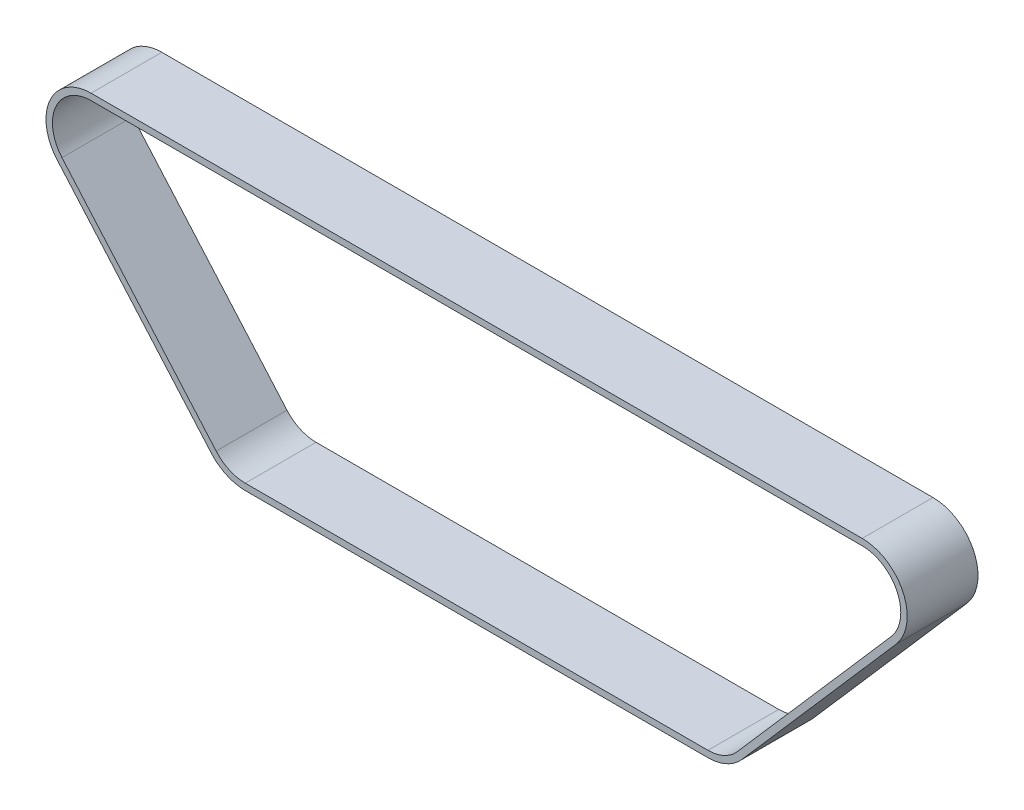
ISO-10303-21;
HEADER;
FILE_DESCRIPTION(('STEP AP214'),'2;1');
FILE_NAME('part.step','',(''),(''),'','','');
FILE_SCHEMA(('AUTOMOTIVE_DESIGN { 1 0 10303 214 1 1 1 1 }'));
ENDSEC;
DATA;
#1=APPLICATION_CONTEXT('core data for automotive mechanical design processes');
#2=APPLICATION_PROTOCOL_DEFINITION('international standard','automotive_design',2000,#1);
#3=PRODUCT_CONTEXT('',#1,'mechanical');
#4=PRODUCT('Part','Part','',(#3));
#5=PRODUCT_RELATED_PRODUCT_CATEGORY('part','',(#4));
#6=PRODUCT_DEFINITION_FORMATION('','',#4);
#7=PRODUCT_DEFINITION_CONTEXT('part definition',#1,'design');
#8=PRODUCT_DEFINITION('design','',#6,#7);
#9=PRODUCT_DEFINITION_SHAPE('','',#8);
#10=(LENGTH_UNIT() NAMED_UNIT(*) SI_UNIT(.MILLI.,.METRE.));
#11=(NAMED_UNIT(*) PLANE_ANGLE_UNIT() SI_UNIT($,.RADIAN.));
#12=(NAMED_UNIT(*) SI_UNIT($,.STERADIAN.) SOLID_ANGLE_UNIT());
#13=UNCERTAINTY_MEASURE_WITH_UNIT(LENGTH_MEASURE(1.E-05),#10,'distance_accuracy_value','');
#14=(GEOMETRIC_REPRESENTATION_CONTEXT(3) GLOBAL_UNCERTAINTY_ASSIGNED_CONTEXT((#13)) GLOBAL_UNIT_ASSIGNED_CONTEXT((#10,
#11,#12)) REPRESENTATION_CONTEXT('',''));
#15=CARTESIAN_POINT('',(0.,0.,0.));
#16=DIRECTION('',(0.,0.,1.));
#17=DIRECTION('',(1.,0.,0.));
#18=AXIS2_PLACEMENT_3D('',#15,#16,#17);
#19=CARTESIAN_POINT('',(389.644660940671,125.,44.));
#20=DIRECTION('',(0.,0.,1.));
#21=DIRECTION('',(1.,0.,0.));
#22=AXIS2_PLACEMENT_3D('',#19,#20,#21);
#23=PLANE('',#22);
#24=CARTESIAN_POINT('',(389.644660940671,125.,44.));
#25=DIRECTION('',(0.,0.,1.));
#26=DIRECTION('',(1.,0.,0.));
#27=AXIS2_PLACEMENT_3D('',#24,#25,#26);
#28=CIRCLE('',#27,28.0000000000001);
#29=CARTESIAN_POINT('',(410.75405843693,106.60452943399,44.));
#30=VERTEX_POINT('',#29);
#31=CARTESIAN_POINT('',(389.644660940671,153.,44.));
#32=VERTEX_POINT('',#31);
#33=EDGE_CURVE('E214',#30,#32,#28,.T.);
#34=ORIENTED_EDGE('',*,*,#33,.T.);
#35=DIRECTION('',(-1.,0.,0.));
#36=VECTOR('',#35,1.);
#37=CARTESIAN_POINT('',(-89.6446609406737,153.,44.));
#38=LINE('',#37,#36);
#39=CARTESIAN_POINT('',(-89.6446609406737,153.,44.));
#40=VERTEX_POINT('',#39);
#41=EDGE_CURVE('E217',#32,#40,#38,.T.);
#42=ORIENTED_EDGE('',*,*,#41,.T.);
#43=CARTESIAN_POINT('',(-89.6446609406738,125.,44.));
#44=DIRECTION('',(0.,0.,1.));
#45=DIRECTION('',(1.,0.,0.));
#46=AXIS2_PLACEMENT_3D('',#43,#44,#45);
#47=CIRCLE('',#46,28.);
#48=CARTESIAN_POINT('',(-110.754058436932,106.60452943399,44.));
#49=VERTEX_POINT('',#48);
#50=EDGE_CURVE('E220',#40,#49,#47,.T.);
#51=ORIENTED_EDGE('',*,*,#50,.T.);
#52=DIRECTION('',(0.656981091643225,-0.753907053437807,0.));
#53=VECTOR('',#52,1.);
#54=CARTESIAN_POINT('',(-110.754058436932,106.60452943399,44.));
#55=LINE('',#54,#53);
#56=CARTESIAN_POINT('',(-14.8961940606622,-3.39547056601034,44.));
#57=VERTEX_POINT('',#56);
#58=EDGE_CURVE('E222',#49,#57,#55,.T.);
#59=ORIENTED_EDGE('',*,*,#58,.T.);
#60=CARTESIAN_POINT('',(6.21320343559641,15.,44.));
#61=DIRECTION('',(0.,0.,1.));
#62=DIRECTION('',(1.,0.,0.));
#63=AXIS2_PLACEMENT_3D('',#60,#61,#62);
#64=CIRCLE('',#63,28.);
#65=CARTESIAN_POINT('',(6.2132034355964,-13.,44.));
#66=VERTEX_POINT('',#65);
#67=EDGE_CURVE('E224',#57,#66,#64,.T.);
#68=ORIENTED_EDGE('',*,*,#67,.T.);
#69=DIRECTION('',(1.,0.,0.));
#70=VECTOR('',#69,1.);
#71=CARTESIAN_POINT('',(6.2132034355964,-13.,44.));
#72=LINE('',#71,#70);
#73=CARTESIAN_POINT('',(293.786796564404,-13.0000000000001,44.));
#74=VERTEX_POINT('',#73);
#75=EDGE_CURVE('E226',#66,#74,#72,.T.);
#76=ORIENTED_EDGE('',*,*,#75,.T.);
#77=CARTESIAN_POINT('',(293.786796564404,15.,44.));
#78=DIRECTION('',(0.,0.,1.));
#79=DIRECTION('',(1.,0.,0.));
#80=AXIS2_PLACEMENT_3D('',#77,#78,#79);
#81=CIRCLE('',#80,28.);
#82=CARTESIAN_POINT('',(314.896194060662,-3.39547056601009,44.));
#83=VERTEX_POINT('',#82);
#84=EDGE_CURVE('E228',#74,#83,#81,.T.);
#85=ORIENTED_EDGE('',*,*,#84,.T.);
#86=DIRECTION('',(0.656981091643215,0.753907053437815,0.));
#87=VECTOR('',#86,1.);
#88=CARTESIAN_POINT('',(314.896194060662,-3.39547056601009,44.));
#89=LINE('',#88,#87);
#90=EDGE_CURVE('E230',#83,#30,#89,.T.);
#91=ORIENTED_EDGE('',*,*,#90,.T.);
#92=EDGE_LOOP('',(#34,#42,#51,#59,#68,#76,#85,#91));
#93=FACE_BOUND('',#92,.T.);
#94=DIRECTION('',(0.656981091643225,-0.753907053437807,0.));
#95=VECTOR('',#94,1.);
#96=CARTESIAN_POINT('',(-107.738430223181,109.232453800563,44.));
#97=LINE('',#96,#95);
#98=CARTESIAN_POINT('',(-107.738430223181,109.232453800563,44.));
#99=VERTEX_POINT('',#98);
#100=CARTESIAN_POINT('',(-11.880565846911,-0.767546199437433,44.));
#101=VERTEX_POINT('',#100);
#102=EDGE_CURVE('E157',#99,#101,#97,.T.);
#103=ORIENTED_EDGE('',*,*,#102,.F.);
#104=CARTESIAN_POINT('',(-89.6446609406738,125.,44.));
#105=DIRECTION('',(0.,0.,1.));
#106=DIRECTION('',(1.,0.,0.));
#107=AXIS2_PLACEMENT_3D('',#104,#105,#106);
#108=CIRCLE('',#107,24.);
#109=CARTESIAN_POINT('',(-89.6446609406738,149.,44.));
#110=VERTEX_POINT('',#109);
#111=EDGE_CURVE('E149',#110,#99,#108,.T.);
#112=ORIENTED_EDGE('',*,*,#111,.F.);
#113=DIRECTION('',(-1.,0.,0.));
#114=VECTOR('',#113,1.);
#115=CARTESIAN_POINT('',(-89.6446609406738,149.,44.));
#116=LINE('',#115,#114);
#117=CARTESIAN_POINT('',(389.644660940671,149.,44.));
#118=VERTEX_POINT('',#117);
#119=EDGE_CURVE('E182',#118,#110,#116,.T.);
#120=ORIENTED_EDGE('',*,*,#119,.F.);
#121=CARTESIAN_POINT('',(389.644660940671,125.,44.));
#122=DIRECTION('',(0.,0.,1.));
#123=DIRECTION('',(1.,0.,0.));
#124=AXIS2_PLACEMENT_3D('',#121,#122,#123);
#125=CIRCLE('',#124,24.);
#126=CARTESIAN_POINT('',(407.738430223179,109.232453800563,44.));
#127=VERTEX_POINT('',#126);
#128=EDGE_CURVE('E180',#127,#118,#125,.T.);
#129=ORIENTED_EDGE('',*,*,#128,.F.);
#130=DIRECTION('',(0.656981091643216,0.753907053437815,0.));
#131=VECTOR('',#130,1.);
#132=CARTESIAN_POINT('',(311.880565846911,-0.767546199437235,44.));
#133=LINE('',#132,#131);
#134=CARTESIAN_POINT('',(311.880565846911,-0.767546199437235,44.));
#135=VERTEX_POINT('',#134);
#136=EDGE_CURVE('E178',#135,#127,#133,.T.);
#137=ORIENTED_EDGE('',*,*,#136,.F.);
#138=CARTESIAN_POINT('',(293.786796564404,15.,44.));
#139=DIRECTION('',(0.,0.,1.));
#140=DIRECTION('',(1.,0.,0.));
#141=AXIS2_PLACEMENT_3D('',#138,#139,#140);
#142=CIRCLE('',#141,24.);
#143=CARTESIAN_POINT('',(293.786796564404,-9.00000000000006,44.));
#144=VERTEX_POINT('',#143);
#145=EDGE_CURVE('E176',#144,#135,#142,.T.);
#146=ORIENTED_EDGE('',*,*,#145,.F.);
#147=DIRECTION('',(1.,0.,0.));
#148=VECTOR('',#147,1.);
#149=CARTESIAN_POINT('',(6.21320343559641,-9.00000000000004,44.));
#150=LINE('',#149,#148);
#151=CARTESIAN_POINT('',(6.21320343559641,-9.00000000000004,44.));
#152=VERTEX_POINT('',#151);
#153=EDGE_CURVE('E172',#152,#144,#150,.T.);
#154=ORIENTED_EDGE('',*,*,#153,.F.);
#155=CARTESIAN_POINT('',(6.21320343559641,15.,44.));
#156=DIRECTION('',(0.,0.,1.));
#157=DIRECTION('',(1.,0.,0.));
#158=AXIS2_PLACEMENT_3D('',#155,#156,#157);
#159=CIRCLE('',#158,24.);
#160=EDGE_CURVE('E170',#101,#152,#159,.T.);
#161=ORIENTED_EDGE('',*,*,#160,.F.);
#162=EDGE_LOOP('',(#103,#112,#120,#129,#137,#146,#154,#161));
#163=FACE_BOUND('',#162,.T.);
#164=ADVANCED_FACE('F36',(#93,#163),#23,.T.);
#165=CARTESIAN_POINT('',(389.644660940671,125.,0.));
#166=DIRECTION('',(0.,0.,1.));
#167=DIRECTION('',(1.,0.,0.));
#168=AXIS2_PLACEMENT_3D('',#165,#166,#167);
#169=PLANE('',#168);
#170=CARTESIAN_POINT('',(389.644660940671,125.,0.));
#171=DIRECTION('',(0.,0.,1.));
#172=DIRECTION('',(1.,0.,0.));
#173=AXIS2_PLACEMENT_3D('',#170,#171,#172);
#174=CIRCLE('',#173,28.0000000000001);
#175=CARTESIAN_POINT('',(410.75405843693,106.60452943399,0.));
#176=VERTEX_POINT('',#175);
#177=CARTESIAN_POINT('',(389.644660940671,153.,0.));
#178=VERTEX_POINT('',#177);
#179=EDGE_CURVE('E165',#176,#178,#174,.T.);
#180=ORIENTED_EDGE('',*,*,#179,.F.);
#181=DIRECTION('',(0.656981091643215,0.753907053437815,0.));
#182=VECTOR('',#181,1.);
#183=CARTESIAN_POINT('',(314.896194060662,-3.39547056601009,0.));
#184=LINE('',#183,#182);
#185=CARTESIAN_POINT('',(314.896194060662,-3.39547056601009,0.));
#186=VERTEX_POINT('',#185);
#187=EDGE_CURVE('E218',#186,#176,#184,.T.);
#188=ORIENTED_EDGE('',*,*,#187,.F.);
#189=CARTESIAN_POINT('',(293.786796564404,15.,0.));
#190=DIRECTION('',(0.,0.,1.));
#191=DIRECTION('',(1.,0.,0.));
#192=AXIS2_PLACEMENT_3D('',#189,#190,#191);
#193=CIRCLE('',#192,28.);
#194=CARTESIAN_POINT('',(293.786796564404,-13.0000000000001,0.));
#195=VERTEX_POINT('',#194);
#196=EDGE_CURVE('E245',#195,#186,#193,.T.);
#197=ORIENTED_EDGE('',*,*,#196,.F.);
#198=DIRECTION('',(1.,0.,0.));
#199=VECTOR('',#198,1.);
#200=CARTESIAN_POINT('',(6.2132034355964,-13.,0.));
#201=LINE('',#200,#199);
#202=CARTESIAN_POINT('',(6.2132034355964,-13.,0.));
#203=VERTEX_POINT('',#202);
#204=EDGE_CURVE('E243',#203,#195,#201,.T.);
#205=ORIENTED_EDGE('',*,*,#204,.F.);
#206=CARTESIAN_POINT('',(6.21320343559641,15.,0.));
#207=DIRECTION('',(0.,0.,1.));
#208=DIRECTION('',(1.,0.,0.));
#209=AXIS2_PLACEMENT_3D('',#206,#207,#208);
#210=CIRCLE('',#209,28.);
#211=CARTESIAN_POINT('',(-14.8961940606622,-3.39547056601034,0.));
#212=VERTEX_POINT('',#211);
#213=EDGE_CURVE('E241',#212,#203,#210,.T.);
#214=ORIENTED_EDGE('',*,*,#213,.F.);
#215=DIRECTION('',(0.656981091643225,-0.753907053437807,0.));
#216=VECTOR('',#215,1.);
#217=CARTESIAN_POINT('',(-110.754058436932,106.60452943399,0.));
#218=LINE('',#217,#216);
#219=CARTESIAN_POINT('',(-110.754058436932,106.60452943399,0.));
#220=VERTEX_POINT('',#219);
#221=EDGE_CURVE('E239',#220,#212,#218,.T.);
#222=ORIENTED_EDGE('',*,*,#221,.F.);
#223=CARTESIAN_POINT('',(-89.6446609406738,125.,0.));
#224=DIRECTION('',(0.,0.,1.));
#225=DIRECTION('',(1.,0.,0.));
#226=AXIS2_PLACEMENT_3D('',#223,#224,#225);
#227=CIRCLE('',#226,28.);
#228=CARTESIAN_POINT('',(-89.6446609406737,153.,0.));
#229=VERTEX_POINT('',#228);
#230=EDGE_CURVE('E237',#229,#220,#227,.T.);
#231=ORIENTED_EDGE('',*,*,#230,.F.);
#232=DIRECTION('',(-1.,0.,0.));
#233=VECTOR('',#232,1.);
#234=CARTESIAN_POINT('',(-89.6446609406737,153.,0.));
#235=LINE('',#234,#233);
#236=EDGE_CURVE('E235',#178,#229,#235,.T.);
#237=ORIENTED_EDGE('',*,*,#236,.F.);
#238=EDGE_LOOP('',(#180,#188,#197,#205,#214,#222,#231,#237));
#239=FACE_BOUND('',#238,.T.);
#240=CARTESIAN_POINT('',(-89.6446609406738,125.,0.));
#241=DIRECTION('',(0.,0.,1.));
#242=DIRECTION('',(1.,0.,0.));
#243=AXIS2_PLACEMENT_3D('',#240,#241,#242);
#244=CIRCLE('',#243,24.);
#245=CARTESIAN_POINT('',(-89.6446609406738,149.,0.));
#246=VERTEX_POINT('',#245);
#247=CARTESIAN_POINT('',(-107.738430223181,109.232453800563,0.));
#248=VERTEX_POINT('',#247);
#249=EDGE_CURVE('E59',#246,#248,#244,.T.);
#250=ORIENTED_EDGE('',*,*,#249,.T.);
#251=DIRECTION('',(0.656981091643225,-0.753907053437807,0.));
#252=VECTOR('',#251,1.);
#253=CARTESIAN_POINT('',(-107.738430223181,109.232453800563,0.));
#254=LINE('',#253,#252);
#255=CARTESIAN_POINT('',(-11.880565846911,-0.767546199437433,0.));
#256=VERTEX_POINT('',#255);
#257=EDGE_CURVE('E164',#248,#256,#254,.T.);
#258=ORIENTED_EDGE('',*,*,#257,.T.);
#259=CARTESIAN_POINT('',(6.21320343559641,15.,0.));
#260=DIRECTION('',(0.,0.,1.));
#261=DIRECTION('',(1.,0.,0.));
#262=AXIS2_PLACEMENT_3D('',#259,#260,#261);
#263=CIRCLE('',#262,24.);
#264=CARTESIAN_POINT('',(6.21320343559641,-9.00000000000004,0.));
#265=VERTEX_POINT('',#264);
#266=EDGE_CURVE('E186',#256,#265,#263,.T.);
#267=ORIENTED_EDGE('',*,*,#266,.T.);
#268=DIRECTION('',(1.,0.,0.));
#269=VECTOR('',#268,1.);
#270=CARTESIAN_POINT('',(6.21320343559641,-9.00000000000004,0.));
#271=LINE('',#270,#269);
#272=CARTESIAN_POINT('',(293.786796564404,-9.00000000000006,0.));
#273=VERTEX_POINT('',#272);
#274=EDGE_CURVE('E189',#265,#273,#271,.T.);
#275=ORIENTED_EDGE('',*,*,#274,.T.);
#276=CARTESIAN_POINT('',(293.786796564404,15.,0.));
#277=DIRECTION('',(0.,0.,1.));
#278=DIRECTION('',(1.,0.,0.));
#279=AXIS2_PLACEMENT_3D('',#276,#277,#278);
#280=CIRCLE('',#279,24.);
#281=CARTESIAN_POINT('',(311.880565846911,-0.767546199437235,0.));
#282=VERTEX_POINT('',#281);
#283=EDGE_CURVE('E192',#273,#282,#280,.T.);
#284=ORIENTED_EDGE('',*,*,#283,.T.);
#285=DIRECTION('',(0.656981091643216,0.753907053437815,0.));
#286=VECTOR('',#285,1.);
#287=CARTESIAN_POINT('',(311.880565846911,-0.767546199437235,0.));
#288=LINE('',#287,#286);
#289=CARTESIAN_POINT('',(407.738430223179,109.232453800563,0.));
#290=VERTEX_POINT('',#289);
#291=EDGE_CURVE('E195',#282,#290,#288,.T.);
#292=ORIENTED_EDGE('',*,*,#291,.T.);
#293=CARTESIAN_POINT('',(389.644660940671,125.,0.));
#294=DIRECTION('',(0.,0.,1.));
#295=DIRECTION('',(1.,0.,0.));
#296=AXIS2_PLACEMENT_3D('',#293,#294,#295);
#297=CIRCLE('',#296,24.);
#298=CARTESIAN_POINT('',(389.644660940671,149.,0.));
#299=VERTEX_POINT('',#298);
#300=EDGE_CURVE('E198',#290,#299,#297,.T.);
#301=ORIENTED_EDGE('',*,*,#300,.T.);
#302=DIRECTION('',(-1.,0.,0.));
#303=VECTOR('',#302,1.);
#304=CARTESIAN_POINT('',(-89.6446609406738,149.,0.));
#305=LINE('',#304,#303);
#306=EDGE_CURVE('E158',#299,#246,#305,.T.);
#307=ORIENTED_EDGE('',*,*,#306,.T.);
#308=EDGE_LOOP('',(#250,#258,#267,#275,#284,#292,#301,#307));
#309=FACE_BOUND('',#308,.T.);
#310=ADVANCED_FACE('F275',(#239,#309),#169,.F.);
#311=CARTESIAN_POINT('',(389.644660940671,125.,44.));
#312=DIRECTION('',(0.,0.,-1.));
#313=DIRECTION('',(-1.,0.,0.));
#314=AXIS2_PLACEMENT_3D('',#311,#312,#313);
#315=CYLINDRICAL_SURFACE('',#314,28.0000000000001);
#316=ORIENTED_EDGE('',*,*,#179,.T.);
#317=DIRECTION('',(0.,0.,-1.));
#318=VECTOR('',#317,1.);
#319=CARTESIAN_POINT('',(389.644660940671,153.,44.));
#320=LINE('',#319,#318);
#321=EDGE_CURVE('E11',#32,#178,#320,.T.);
#322=ORIENTED_EDGE('',*,*,#321,.F.);
#323=ORIENTED_EDGE('',*,*,#33,.F.);
#324=DIRECTION('',(0.,0.,-1.));
#325=VECTOR('',#324,1.);
#326=CARTESIAN_POINT('',(410.75405843693,106.60452943399,44.));
#327=LINE('',#326,#325);
#328=EDGE_CURVE('E232',#30,#176,#327,.T.);
#329=ORIENTED_EDGE('',*,*,#328,.T.);
#330=EDGE_LOOP('',(#316,#322,#323,#329));
#331=FACE_BOUND('',#330,.T.);
#332=ADVANCED_FACE('F38',(#331),#315,.T.);
#333=CARTESIAN_POINT('',(-89.6446609406737,153.,44.));
#334=DIRECTION('',(0.,-1.,0.));
#335=DIRECTION('',(0.,0.,-1.));
#336=AXIS2_PLACEMENT_3D('',#333,#334,#335);
#337=PLANE('',#336);
#338=ORIENTED_EDGE('',*,*,#236,.T.);
#339=DIRECTION('',(0.,0.,-1.));
#340=VECTOR('',#339,1.);
#341=CARTESIAN_POINT('',(-89.6446609406737,153.,44.));
#342=LINE('',#341,#340);
#343=EDGE_CURVE('E44',#40,#229,#342,.T.);
#344=ORIENTED_EDGE('',*,*,#343,.F.);
#345=ORIENTED_EDGE('',*,*,#41,.F.);
#346=ORIENTED_EDGE('',*,*,#321,.T.);
#347=EDGE_LOOP('',(#338,#344,#345,#346));
#348=FACE_BOUND('',#347,.T.);
#349=ADVANCED_FACE('F292',(#348),#337,.F.);
#350=CARTESIAN_POINT('',(-89.6446609406738,125.,44.));
#351=DIRECTION('',(0.,0.,-1.));
#352=DIRECTION('',(-1.,0.,0.));
#353=AXIS2_PLACEMENT_3D('',#350,#351,#352);
#354=CYLINDRICAL_SURFACE('',#353,28.);
#355=ORIENTED_EDGE('',*,*,#230,.T.);
#356=DIRECTION('',(0.,0.,-1.));
#357=VECTOR('',#356,1.);
#358=CARTESIAN_POINT('',(-110.754058436932,106.60452943399,44.));
#359=LINE('',#358,#357);
#360=EDGE_CURVE('E262',#49,#220,#359,.T.);
#361=ORIENTED_EDGE('',*,*,#360,.F.);
#362=ORIENTED_EDGE('',*,*,#50,.F.);
#363=ORIENTED_EDGE('',*,*,#343,.T.);
#364=EDGE_LOOP('',(#355,#361,#362,#363));
#365=FACE_BOUND('',#364,.T.);
#366=ADVANCED_FACE('F269',(#365),#354,.T.);
#367=CARTESIAN_POINT('',(-110.754058436932,106.60452943399,44.));
#368=DIRECTION('',(0.753907053437807,0.656981091643225,0.));
#369=DIRECTION('',(-0.656981091643225,0.753907053437807,0.));
#370=AXIS2_PLACEMENT_3D('',#367,#368,#369);
#371=PLANE('',#370);
#372=ORIENTED_EDGE('',*,*,#221,.T.);
#373=DIRECTION('',(0.,0.,-1.));
#374=VECTOR('',#373,1.);
#375=CARTESIAN_POINT('',(-14.8961940606622,-3.39547056601034,44.));
#376=LINE('',#375,#374);
#377=EDGE_CURVE('E259',#57,#212,#376,.T.);
#378=ORIENTED_EDGE('',*,*,#377,.F.);
#379=ORIENTED_EDGE('',*,*,#58,.F.);
#380=ORIENTED_EDGE('',*,*,#360,.T.);
#381=EDGE_LOOP('',(#372,#378,#379,#380));
#382=FACE_BOUND('',#381,.T.);
#383=ADVANCED_FACE('F281',(#382),#371,.F.);
#384=CARTESIAN_POINT('',(6.21320343559641,15.,44.));
#385=DIRECTION('',(0.,0.,-1.));
#386=DIRECTION('',(-1.,0.,0.));
#387=AXIS2_PLACEMENT_3D('',#384,#385,#386);
#388=CYLINDRICAL_SURFACE('',#387,28.);
#389=ORIENTED_EDGE('',*,*,#213,.T.);
#390=DIRECTION('',(0.,0.,-1.));
#391=VECTOR('',#390,1.);
#392=CARTESIAN_POINT('',(6.2132034355964,-13.,44.));
#393=LINE('',#392,#391);
#394=EDGE_CURVE('E256',#66,#203,#393,.T.);
#395=ORIENTED_EDGE('',*,*,#394,.F.);
#396=ORIENTED_EDGE('',*,*,#67,.F.);
#397=ORIENTED_EDGE('',*,*,#377,.T.);
#398=EDGE_LOOP('',(#389,#395,#396,#397));
#399=FACE_BOUND('',#398,.T.);
#400=ADVANCED_FACE('F285',(#399),#388,.T.);
#401=CARTESIAN_POINT('',(6.2132034355964,-13.,44.));
#402=DIRECTION('',(0.,1.,0.));
#403=DIRECTION('',(-1.,0.,0.));
#404=AXIS2_PLACEMENT_3D('',#401,#402,#403);
#405=PLANE('',#404);
#406=ORIENTED_EDGE('',*,*,#204,.T.);
#407=DIRECTION('',(0.,0.,-1.));
#408=VECTOR('',#407,1.);
#409=CARTESIAN_POINT('',(293.786796564404,-13.0000000000001,44.));
#410=LINE('',#409,#408);
#411=EDGE_CURVE('E253',#74,#195,#410,.T.);
#412=ORIENTED_EDGE('',*,*,#411,.F.);
#413=ORIENTED_EDGE('',*,*,#75,.F.);
#414=ORIENTED_EDGE('',*,*,#394,.T.);
#415=EDGE_LOOP('',(#406,#412,#413,#414));
#416=FACE_BOUND('',#415,.T.);
#417=ADVANCED_FACE('F305',(#416),#405,.F.);
#418=CARTESIAN_POINT('',(293.786796564404,15.,44.));
#419=DIRECTION('',(0.,0.,-1.));
#420=DIRECTION('',(-1.,0.,0.));
#421=AXIS2_PLACEMENT_3D('',#418,#419,#420);
#422=CYLINDRICAL_SURFACE('',#421,28.);
#423=ORIENTED_EDGE('',*,*,#196,.T.);
#424=DIRECTION('',(0.,0.,-1.));
#425=VECTOR('',#424,1.);
#426=CARTESIAN_POINT('',(314.896194060662,-3.39547056601009,44.));
#427=LINE('',#426,#425);
#428=EDGE_CURVE('E250',#83,#186,#427,.T.);
#429=ORIENTED_EDGE('',*,*,#428,.F.);
#430=ORIENTED_EDGE('',*,*,#84,.F.);
#431=ORIENTED_EDGE('',*,*,#411,.T.);
#432=EDGE_LOOP('',(#423,#429,#430,#431));
#433=FACE_BOUND('',#432,.T.);
#434=ADVANCED_FACE('F303',(#433),#422,.T.);
#435=CARTESIAN_POINT('',(314.896194060662,-3.39547056601009,44.));
#436=DIRECTION('',(-0.753907053437815,0.656981091643215,0.));
#437=DIRECTION('',(-0.656981091643215,-0.753907053437815,0.));
#438=AXIS2_PLACEMENT_3D('',#435,#436,#437);
#439=PLANE('',#438);
#440=ORIENTED_EDGE('',*,*,#187,.T.);
#441=ORIENTED_EDGE('',*,*,#328,.F.);
#442=ORIENTED_EDGE('',*,*,#90,.F.);
#443=ORIENTED_EDGE('',*,*,#428,.T.);
#444=EDGE_LOOP('',(#440,#441,#442,#443));
#445=FACE_BOUND('',#444,.T.);
#446=ADVANCED_FACE('F298',(#445),#439,.F.);
#447=CARTESIAN_POINT('',(-89.6446609406738,125.,44.));
#448=DIRECTION('',(0.,0.,-1.));
#449=DIRECTION('',(-1.,0.,0.));
#450=AXIS2_PLACEMENT_3D('',#447,#448,#449);
#451=CYLINDRICAL_SURFACE('',#450,24.);
#452=ORIENTED_EDGE('',*,*,#249,.F.);
#453=DIRECTION('',(0.,0.,-1.));
#454=VECTOR('',#453,1.);
#455=CARTESIAN_POINT('',(-89.6446609406738,149.,44.));
#456=LINE('',#455,#454);
#457=EDGE_CURVE('E153',#110,#246,#456,.T.);
#458=ORIENTED_EDGE('',*,*,#457,.F.);
#459=ORIENTED_EDGE('',*,*,#111,.T.);
#460=DIRECTION('',(0.,0.,-1.));
#461=VECTOR('',#460,1.);
#462=CARTESIAN_POINT('',(-107.738430223181,109.232453800563,44.));
#463=LINE('',#462,#461);
#464=EDGE_CURVE('E152',#99,#248,#463,.T.);
#465=ORIENTED_EDGE('',*,*,#464,.T.);
#466=EDGE_LOOP('',(#452,#458,#459,#465));
#467=FACE_BOUND('',#466,.T.);
#468=ADVANCED_FACE('F151',(#467),#451,.F.);
#469=CARTESIAN_POINT('',(-107.738430223181,109.232453800563,44.));
#470=DIRECTION('',(0.753907053437807,0.656981091643225,0.));
#471=DIRECTION('',(-0.656981091643225,0.753907053437807,0.));
#472=AXIS2_PLACEMENT_3D('',#469,#470,#471);
#473=PLANE('',#472);
#474=ORIENTED_EDGE('',*,*,#257,.F.);
#475=ORIENTED_EDGE('',*,*,#464,.F.);
#476=ORIENTED_EDGE('',*,*,#102,.T.);
#477=DIRECTION('',(0.,0.,-1.));
#478=VECTOR('',#477,1.);
#479=CARTESIAN_POINT('',(-11.880565846911,-0.767546199437433,44.));
#480=LINE('',#479,#478);
#481=EDGE_CURVE('E166',#101,#256,#480,.T.);
#482=ORIENTED_EDGE('',*,*,#481,.T.);
#483=EDGE_LOOP('',(#474,#475,#476,#482));
#484=FACE_BOUND('',#483,.T.);
#485=ADVANCED_FACE('F161',(#484),#473,.T.);
#486=CARTESIAN_POINT('',(6.21320343559641,15.,44.));
#487=DIRECTION('',(0.,0.,-1.));
#488=DIRECTION('',(-1.,0.,0.));
#489=AXIS2_PLACEMENT_3D('',#486,#487,#488);
#490=CYLINDRICAL_SURFACE('',#489,24.);
#491=ORIENTED_EDGE('',*,*,#266,.F.);
#492=ORIENTED_EDGE('',*,*,#481,.F.);
#493=ORIENTED_EDGE('',*,*,#160,.T.);
#494=DIRECTION('',(0.,0.,-1.));
#495=VECTOR('',#494,1.);
#496=CARTESIAN_POINT('',(6.21320343559641,-9.00000000000004,44.));
#497=LINE('',#496,#495);
#498=EDGE_CURVE('E211',#152,#265,#497,.T.);
#499=ORIENTED_EDGE('',*,*,#498,.T.);
#500=EDGE_LOOP('',(#491,#492,#493,#499));
#501=FACE_BOUND('',#500,.T.);
#502=ADVANCED_FACE('F330',(#501),#490,.F.);
#503=CARTESIAN_POINT('',(6.21320343559641,-9.00000000000004,44.));
#504=DIRECTION('',(0.,1.,0.));
#505=DIRECTION('',(0.,0.,1.));
#506=AXIS2_PLACEMENT_3D('',#503,#504,#505);
#507=PLANE('',#506);
#508=ORIENTED_EDGE('',*,*,#274,.F.);
#509=ORIENTED_EDGE('',*,*,#498,.F.);
#510=ORIENTED_EDGE('',*,*,#153,.T.);
#511=DIRECTION('',(0.,0.,-1.));
#512=VECTOR('',#511,1.);
#513=CARTESIAN_POINT('',(293.786796564404,-9.00000000000006,44.));
#514=LINE('',#513,#512);
#515=EDGE_CURVE('E209',#144,#273,#514,.T.);
#516=ORIENTED_EDGE('',*,*,#515,.T.);
#517=EDGE_LOOP('',(#508,#509,#510,#516));
#518=FACE_BOUND('',#517,.T.);
#519=ADVANCED_FACE('F334',(#518),#507,.T.);
#520=CARTESIAN_POINT('',(293.786796564404,15.,44.));
#521=DIRECTION('',(0.,0.,-1.));
#522=DIRECTION('',(-1.,0.,0.));
#523=AXIS2_PLACEMENT_3D('',#520,#521,#522);
#524=CYLINDRICAL_SURFACE('',#523,24.);
#525=ORIENTED_EDGE('',*,*,#283,.F.);
#526=ORIENTED_EDGE('',*,*,#515,.F.);
#527=ORIENTED_EDGE('',*,*,#145,.T.);
#528=DIRECTION('',(0.,0.,-1.));
#529=VECTOR('',#528,1.);
#530=CARTESIAN_POINT('',(311.880565846911,-0.767546199437235,44.));
#531=LINE('',#530,#529);
#532=EDGE_CURVE('E207',#135,#282,#531,.T.);
#533=ORIENTED_EDGE('',*,*,#532,.T.);
#534=EDGE_LOOP('',(#525,#526,#527,#533));
#535=FACE_BOUND('',#534,.T.);
#536=ADVANCED_FACE('F340',(#535),#524,.F.);
#537=CARTESIAN_POINT('',(311.880565846911,-0.767546199437235,44.));
#538=DIRECTION('',(-0.753907053437815,0.656981091643216,0.));
#539=DIRECTION('',(-0.656981091643216,-0.753907053437815,0.));
#540=AXIS2_PLACEMENT_3D('',#537,#538,#539);
#541=PLANE('',#540);
#542=ORIENTED_EDGE('',*,*,#291,.F.);
#543=ORIENTED_EDGE('',*,*,#532,.F.);
#544=ORIENTED_EDGE('',*,*,#136,.T.);
#545=DIRECTION('',(0.,0.,-1.));
#546=VECTOR('',#545,1.);
#547=CARTESIAN_POINT('',(407.738430223179,109.232453800563,44.));
#548=LINE('',#547,#546);
#549=EDGE_CURVE('E205',#127,#290,#548,.T.);
#550=ORIENTED_EDGE('',*,*,#549,.T.);
#551=EDGE_LOOP('',(#542,#543,#544,#550));
#552=FACE_BOUND('',#551,.T.);
#553=ADVANCED_FACE('F344',(#552),#541,.T.);
#554=CARTESIAN_POINT('',(389.644660940671,125.,44.));
#555=DIRECTION('',(0.,0.,-1.));
#556=DIRECTION('',(-1.,0.,0.));
#557=AXIS2_PLACEMENT_3D('',#554,#555,#556);
#558=CYLINDRICAL_SURFACE('',#557,24.);
#559=ORIENTED_EDGE('',*,*,#300,.F.);
#560=ORIENTED_EDGE('',*,*,#549,.F.);
#561=ORIENTED_EDGE('',*,*,#128,.T.);
#562=DIRECTION('',(0.,0.,-1.));
#563=VECTOR('',#562,1.);
#564=CARTESIAN_POINT('',(389.644660940671,149.,44.));
#565=LINE('',#564,#563);
#566=EDGE_CURVE('E51',#118,#299,#565,.T.);
#567=ORIENTED_EDGE('',*,*,#566,.T.);
#568=EDGE_LOOP('',(#559,#560,#561,#567));
#569=FACE_BOUND('',#568,.T.);
#570=ADVANCED_FACE('F348',(#569),#558,.F.);
#571=CARTESIAN_POINT('',(-89.6446609406738,149.,44.));
#572=DIRECTION('',(0.,-1.,0.));
#573=DIRECTION('',(1.,0.,0.));
#574=AXIS2_PLACEMENT_3D('',#571,#572,#573);
#575=PLANE('',#574);
#576=ORIENTED_EDGE('',*,*,#306,.F.);
#577=ORIENTED_EDGE('',*,*,#566,.F.);
#578=ORIENTED_EDGE('',*,*,#119,.T.);
#579=ORIENTED_EDGE('',*,*,#457,.T.);
#580=EDGE_LOOP('',(#576,#577,#578,#579));
#581=FACE_BOUND('',#580,.T.);
#582=ADVANCED_FACE('F352',(#581),#575,.T.);
#583=CLOSED_SHELL('',(#164,#310,#332,#349,#366,#383,#400,#417,#434,#446,#468,#485,#502,#519,
#536,#553,#570,#582));
#584=MANIFOLD_SOLID_BREP('B2',#583);
#585=ADVANCED_BREP_SHAPE_REPRESENTATION('',(#18,#584),#14);
#586=SHAPE_DEFINITION_REPRESENTATION(#9,#585);
ENDSEC;
END-ISO-10303-21;
